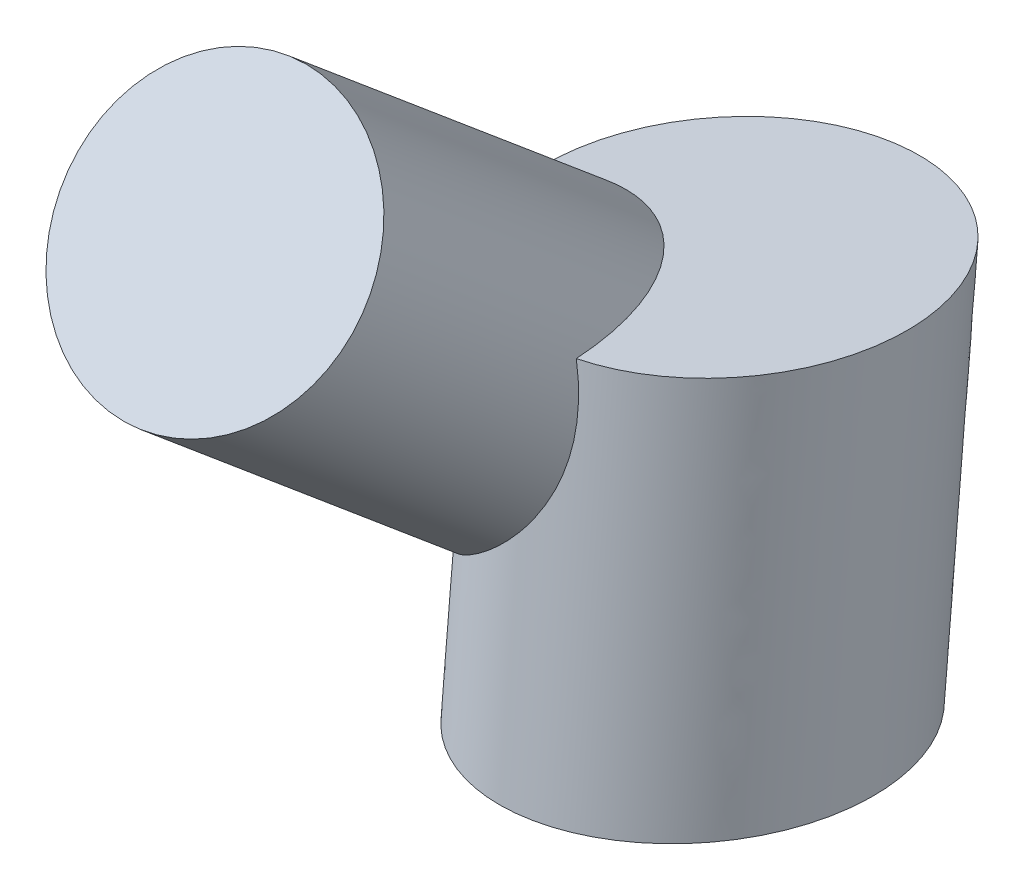
ISO-10303-21;
HEADER;
FILE_DESCRIPTION(('STEP AP214'),'2;1');
FILE_NAME('part.step','',(''),(''),'','','');
FILE_SCHEMA(('AUTOMOTIVE_DESIGN { 1 0 10303 214 1 1 1 1 }'));
ENDSEC;
DATA;
#1=APPLICATION_CONTEXT('core data for automotive mechanical design processes');
#2=APPLICATION_PROTOCOL_DEFINITION('international standard','automotive_design',2000,#1);
#3=PRODUCT_CONTEXT('',#1,'mechanical');
#4=PRODUCT('Part','Part','',(#3));
#5=PRODUCT_RELATED_PRODUCT_CATEGORY('part','',(#4));
#6=PRODUCT_DEFINITION_FORMATION('','',#4);
#7=PRODUCT_DEFINITION_CONTEXT('part definition',#1,'design');
#8=PRODUCT_DEFINITION('design','',#6,#7);
#9=PRODUCT_DEFINITION_SHAPE('','',#8);
#10=(LENGTH_UNIT() NAMED_UNIT(*) SI_UNIT(.MILLI.,.METRE.));
#11=(NAMED_UNIT(*) PLANE_ANGLE_UNIT() SI_UNIT($,.RADIAN.));
#12=(NAMED_UNIT(*) SI_UNIT($,.STERADIAN.) SOLID_ANGLE_UNIT());
#13=UNCERTAINTY_MEASURE_WITH_UNIT(LENGTH_MEASURE(1.E-05),#10,'distance_accuracy_value','');
#14=(GEOMETRIC_REPRESENTATION_CONTEXT(3) GLOBAL_UNCERTAINTY_ASSIGNED_CONTEXT((#13)) GLOBAL_UNIT_ASSIGNED_CONTEXT((#10,
#11,#12)) REPRESENTATION_CONTEXT('',''));
#15=CARTESIAN_POINT('',(0.,0.,0.));
#16=DIRECTION('',(0.,0.,1.));
#17=DIRECTION('',(1.,0.,0.));
#18=AXIS2_PLACEMENT_3D('',#15,#16,#17);
#19=CARTESIAN_POINT('',(9.8530099761229,469.487751563095,-26.0815234338281));
#20=DIRECTION('',(0.,0.996194698091746,-0.0871557427476584));
#21=DIRECTION('',(0.,0.0871557427476584,0.996194698091746));
#22=AXIS2_PLACEMENT_3D('',#19,#20,#21);
#23=ELLIPSE('',#22,19.05,15.875);
#24=DIRECTION('',(0.,-0.996194698091746,0.0871557427476584));
#25=VECTOR('',#24,1.);
#26=SURFACE_OF_LINEAR_EXTRUSION('',#23,#25);
#27=CARTESIAN_POINT('',(13.5633757047033,471.102082707643,-7.62963401766272));
#28=VERTEX_POINT('',#27);
#29=CARTESIAN_POINT('',(-5.90740162400137,469.686880477689,-23.8054695250432));
#30=VERTEX_POINT('',#29);
#31=EDGE_CURVE('E47',#28,#30,#23,.T.);
#32=ORIENTED_EDGE('',*,*,#31,.F.);
#33=CARTESIAN_POINT('',(13.5633757047033,471.102082707643,-7.62963401766271));
#34=CARTESIAN_POINT('',(13.6165670345337,470.827771900835,-7.6210492455901));
#35=CARTESIAN_POINT('',(13.6646932775911,470.55250959644,-7.61124109338902));
#36=CARTESIAN_POINT('',(13.7506920936666,470.00022944991,-7.58884588358467));
#37=CARTESIAN_POINT('',(13.7885547461959,469.723210172275,-7.57625615857145));
#38=CARTESIAN_POINT('',(13.8538160357362,469.167955200506,-7.54797390718162));
#39=CARTESIAN_POINT('',(13.8812094481063,468.889718968926,-7.53227983750484));
#40=CARTESIAN_POINT('',(13.925276085072,468.332565765513,-7.49754116620548));
#41=CARTESIAN_POINT('',(13.9419478488632,468.053648706113,-7.47849610846714));
#42=CARTESIAN_POINT('',(13.9643437608906,467.49443166057,-7.4367833371205));
#43=CARTESIAN_POINT('',(13.970020464502,467.214130890668,-7.41410037901978));
#44=CARTESIAN_POINT('',(13.9699794295825,466.653909551743,-7.3650740135879));
#45=CARTESIAN_POINT('',(13.9642642339391,466.373988911823,-7.33873142437673));
#46=CARTESIAN_POINT('',(13.9411272288269,465.815048108093,-7.2823799401142));
#47=CARTESIAN_POINT('',(13.9237076326214,465.536027784056,-7.25237173909549));
#48=CARTESIAN_POINT('',(13.8768493994267,464.97941159824,-7.18879270569786));
#49=CARTESIAN_POINT('',(13.8474108273517,464.701815728775,-7.15522189256126));
#50=CARTESIAN_POINT('',(13.763279404808,464.048143750294,-7.07193272986096));
#51=CARTESIAN_POINT('',(13.7032976966812,463.672915018382,-7.02077778803651));
#52=CARTESIAN_POINT('',(13.5597952880399,462.927686378044,-6.91321837542489));
#53=CARTESIAN_POINT('',(13.4762707841336,462.557687324635,-6.85681305741457));
#54=CARTESIAN_POINT('',(13.2852750566683,461.824470989986,-6.74022735202834));
#55=CARTESIAN_POINT('',(13.1778012421299,461.461254447129,-6.68004655670526));
#56=CARTESIAN_POINT('',(12.9393246695228,460.744629215983,-6.55812999111552));
#57=CARTESIAN_POINT('',(12.808422588263,460.391185753072,-6.49640180990959));
#58=CARTESIAN_POINT('',(12.5230905383388,459.69388279917,-6.37351963175896));
#59=CARTESIAN_POINT('',(12.3686635716561,459.350022091949,-6.3123655626081));
#60=CARTESIAN_POINT('',(12.0370320558073,458.673118737102,-6.19335741085303));
#61=CARTESIAN_POINT('',(11.8598415345485,458.340069583949,-6.13550132732301));
#62=CARTESIAN_POINT('',(11.5515880984432,457.803557739419,-6.04573997634851));
#63=CARTESIAN_POINT('',(11.4269409868335,457.596685415447,-6.01200173041274));
#64=CARTESIAN_POINT('',(11.169165866053,457.187828967406,-5.94784902788867));
#65=CARTESIAN_POINT('',(11.0360399662644,456.985843644654,-5.91743374967445));
#66=CARTESIAN_POINT('',(10.7617451992319,456.586889258335,-5.86071527076287));
#67=CARTESIAN_POINT('',(10.6205783708441,456.389918941331,-5.834411033948));
#68=CARTESIAN_POINT('',(10.3306759591645,456.001027932633,-5.78667881933683));
#69=CARTESIAN_POINT('',(10.1819398519213,455.8091075919,-5.76525117966572));
#70=CARTESIAN_POINT('',(9.73235304139759,455.249928290219,-5.71031245768859));
#71=CARTESIAN_POINT('',(9.42153493712816,454.889751207018,-5.68472787398842));
#72=CARTESIAN_POINT('',(8.93876370647966,454.364111981239,-5.66635660087526));
#73=CARTESIAN_POINT('',(8.77503169597699,454.191287645471,-5.66356924974426));
#74=CARTESIAN_POINT('',(8.44264420790784,453.850392269869,-5.66522229908513));
#75=CARTESIAN_POINT('',(8.27398785472343,453.682322085981,-5.66966399276517));
#76=CARTESIAN_POINT('',(7.87505719178579,453.295199767119,-5.68908836408938));
#77=CARTESIAN_POINT('',(7.64312560026286,453.077999005175,-5.70711219881489));
#78=CARTESIAN_POINT('',(7.17335279617275,452.651706719835,-5.75801310062853));
#79=CARTESIAN_POINT('',(6.93550930515068,452.442618405057,-5.79089598099697));
#80=CARTESIAN_POINT('',(6.45570948753111,452.032281772116,-5.8722903008697));
#81=CARTESIAN_POINT('',(6.21375261001835,451.831034516198,-5.9208038496964));
#82=CARTESIAN_POINT('',(5.72718490934467,451.435740550277,-6.03404797635889));
#83=CARTESIAN_POINT('',(5.48257086511274,451.241704236185,-6.09880099865345));
#84=CARTESIAN_POINT('',(4.99280684779816,450.860690838361,-6.24472895052429));
#85=CARTESIAN_POINT('',(4.74765694956367,450.673712828018,-6.32590171556779));
#86=CARTESIAN_POINT('',(4.25854275309893,450.306309011974,-6.50465187741623));
#87=CARTESIAN_POINT('',(4.01457811922063,450.125881244834,-6.60222431332489));
#88=CARTESIAN_POINT('',(3.62574284692296,449.841442922815,-6.77156892359237));
#89=CARTESIAN_POINT('',(3.47999348928825,449.7355392457,-6.83819973277153));
#90=CARTESIAN_POINT('',(3.18983246127351,449.52576074089,-6.9772363086371));
#91=CARTESIAN_POINT('',(3.04542056619863,449.421885569029,-7.04964108490221));
#92=CARTESIAN_POINT('',(2.75823574330752,449.216013355384,-7.20011604490567));
#93=CARTESIAN_POINT('',(2.61546272816338,449.114016213353,-7.27818592514003));
#94=CARTESIAN_POINT('',(2.33219465260454,448.911999010274,-7.43965585333366));
#95=CARTESIAN_POINT('',(2.19169479604518,448.811974650019,-7.52304211137375));
#96=CARTESIAN_POINT('',(1.91287674822779,448.613487227757,-7.6951686236373));
#97=CARTESIAN_POINT('',(1.7745586741385,448.515024249601,-7.78390916417644));
#98=CARTESIAN_POINT('',(1.50035413819728,448.319506108636,-7.96656884700615));
#99=CARTESIAN_POINT('',(1.364467800471,448.22245101774,-8.06048825265387));
#100=CARTESIAN_POINT('',(1.22992551594694,448.12602538934,-8.15690688012083));
#101=B_SPLINE_CURVE_WITH_KNOTS('',3,(#33,#34,#35,#36,#37,#38,#39,#40,#41,#42,#43,#44,#45,#46,
#47,#48,#49,#50,#51,#52,#53,#54,#55,#56,#57,#58,#59,#60,#61,#62,#63,#64,#65,#66,#67,#68,#69,#70,
#71,#72,#73,#74,#75,#76,#77,#78,#79,#80,#81,#82,#83,#84,#85,#86,#87,#88,#89,#90,#91,#92,#93,#94,
#95,#96,#97,#98,#99,#100),.UNSPECIFIED.,.F.,.F.,(4,2,2,2,2,2,2,2,2,2,2,2,2,2,2,2,2,2,2,2,2,2,2,
2,2,2,2,2,2,2,2,2,2,4),(0.,0.83861759672078,1.67804290975134,2.51788658999194,3.35784467311395,
4.20141924241197,5.04480553098672,5.88803238287697,6.73125468057897,7.88070713171449,
9.03034538601904,10.1801080754893,11.3250436719521,12.4698332867975,13.6139207857162,
14.345325442489,15.076548843338,15.8075876536324,16.5386771360205,17.9660178458795,
18.680111112075,19.3943321368855,20.3486104435983,21.3032624147305,22.2580432679251,
23.2141510599897,24.1701328951766,25.1258260648564,25.7020022590883,26.2780798322605,
26.8541265652324,27.4287355415606,28.0033752718924,28.5780442509673),.UNSPECIFIED.);
#102=CARTESIAN_POINT('',(1.2299255159471,448.12602538934,-8.15690688012068));
#103=VERTEX_POINT('',#102);
#104=EDGE_CURVE('E54',#28,#103,#101,.T.);
#105=ORIENTED_EDGE('',*,*,#104,.T.);
#106=CARTESIAN_POINT('',(1.39611413213234,447.956050131906,-8.01428070429874));
#107=CARTESIAN_POINT('',(1.27940626923087,448.073794201501,-8.11307970966887));
#108=CARTESIAN_POINT('',(1.16484044467143,448.192769886899,-8.21291216340599));
#109=CARTESIAN_POINT('',(0.939832500503709,448.432972180461,-8.41446581934122));
#110=CARTESIAN_POINT('',(0.829389994450478,448.55419857608,-8.51618684319439));
#111=CARTESIAN_POINT('',(0.50409838025061,448.920829560635,-8.82382676711241));
#112=CARTESIAN_POINT('',(0.295152483936782,449.1693206738,-9.03233556851972));
#113=CARTESIAN_POINT('',(-0.107684436272714,449.672558677037,-9.45460239143092));
#114=CARTESIAN_POINT('',(-0.301608077162463,449.927290337353,-9.66834763365102));
#115=CARTESIAN_POINT('',(-0.676012337318118,450.442523889815,-10.100679917492));
#116=CARTESIAN_POINT('',(-0.856490920837997,450.70302664806,-10.3192676858563));
#117=CARTESIAN_POINT('',(-1.20449964115137,451.228283240622,-10.7600102989482));
#118=CARTESIAN_POINT('',(-1.37205900111147,451.493025740751,-10.9821556331632));
#119=CARTESIAN_POINT('',(-1.69551489023901,452.026668669046,-11.4299352174756));
#120=CARTESIAN_POINT('',(-1.85141042621159,452.295569448949,-11.6555697627159));
#121=CARTESIAN_POINT('',(-2.3028596924854,453.107911324659,-12.3372055310138));
#122=CARTESIAN_POINT('',(-2.58200952808987,453.656737200564,-12.7977251210668));
#123=CARTESIAN_POINT('',(-3.10089451620098,454.764262292295,-13.7270490170578));
#124=CARTESIAN_POINT('',(-3.34068140349183,455.322947462292,-14.1958415371463));
#125=CARTESIAN_POINT('',(-3.78490857890271,456.448350158042,-15.1401665240761));
#126=CARTESIAN_POINT('',(-3.98935616423466,457.01506599933,-15.6156975774825));
#127=CARTESIAN_POINT('',(-4.33656282263723,458.066319283577,-16.497803820568));
#128=CARTESIAN_POINT('',(-4.48397148780892,458.549964141056,-16.9036300421001));
#129=CARTESIAN_POINT('',(-4.75695606058085,459.520886491602,-17.7183306283447));
#130=CARTESIAN_POINT('',(-4.88253041595131,460.008164240369,-18.1272052076158));
#131=CARTESIAN_POINT('',(-5.11297658676444,460.985861238376,-18.9475903980467));
#132=CARTESIAN_POINT('',(-5.21783650517289,461.476282126872,-19.3591023847053));
#133=CARTESIAN_POINT('',(-5.40762056997983,462.459384379012,-20.1840231218852));
#134=CARTESIAN_POINT('',(-5.49254437108227,462.952065781657,-20.5974319051327));
#135=CARTESIAN_POINT('',(-5.64434021639546,463.947160462288,-21.4324154846362));
#136=CARTESIAN_POINT('',(-5.71089688929334,464.449601903571,-21.8540139127057));
#137=CARTESIAN_POINT('',(-5.82462341848205,465.455775422358,-22.6982937412198));
#138=CARTESIAN_POINT('',(-5.8717929446372,465.959507521692,-23.1209751599828));
#139=CARTESIAN_POINT('',(-5.94705984331516,466.967134747163,-23.9664747932404));
#140=CARTESIAN_POINT('',(-5.97518240818654,467.471028772566,-24.3892920841082));
#141=CARTESIAN_POINT('',(-6.01263440090325,468.479200430331,-25.2352485503024));
#142=CARTESIAN_POINT('',(-6.02196482645686,468.983478040907,-25.658387707347));
#143=CARTESIAN_POINT('',(-6.02199002387711,469.487751563096,-26.0815234338285));
#144=B_SPLINE_CURVE_WITH_KNOTS('',3,(#106,#107,#108,#109,#110,#111,#112,#113,#114,#115,#116,
#117,#118,#119,#120,#121,#122,#123,#124,#125,#126,#127,#128,#129,#130,#131,#132,#133,#134,#135,
#136,#137,#138,#139,#140,#141,#142,#143),.UNSPECIFIED.,.F.,.F.,(4,2,2,2,2,2,2,2,2,2,2,2,2,2,2,2,
2,2,4),(0.,0.57893009391759,1.1578057925396,2.31489702111002,3.46940107847964,4.62407958807763,
5.77606454123194,6.92814747652572,9.23342710921038,11.5356522218502,13.8374013786846,
15.7820132477283,17.7267633053129,19.6726270748947,21.6185245445946,23.5960059196398,
25.5735209670007,27.5484153313094,29.5232048421821),.UNSPECIFIED.);
#145=CARTESIAN_POINT('',(-6.00870948574133,468.447273892586,-25.2084590042553));
#146=VERTEX_POINT('',#145);
#147=EDGE_CURVE('E58',#103,#146,#144,.T.);
#148=ORIENTED_EDGE('',*,*,#147,.T.);
#149=CARTESIAN_POINT('',(-6.00870948574133,468.447273892586,-25.2084590042553));
#150=CARTESIAN_POINT('',(-6.00582656788919,468.515267917944,-25.1295635174161));
#151=CARTESIAN_POINT('',(-6.00247858679975,468.58342072954,-25.0508220025972));
#152=CARTESIAN_POINT('',(-5.99486069875364,468.720019829013,-24.8936644846526));
#153=CARTESIAN_POINT('',(-5.99059096381481,468.788466059798,-24.81524842357));
#154=CARTESIAN_POINT('',(-5.98113712018249,468.925646994438,-24.6587371124899));
#155=CARTESIAN_POINT('',(-5.97595309512842,468.994381671345,-24.5806418338154));
#156=CARTESIAN_POINT('',(-5.96467745017632,469.132133923392,-24.4247672729803));
#157=CARTESIAN_POINT('',(-5.95858583226691,469.201151497913,-24.3469879901277));
#158=CARTESIAN_POINT('',(-5.94550109357916,469.339464350468,-24.1917397796198));
#159=CARTESIAN_POINT('',(-5.93850788844439,469.408759653899,-24.1142708817056));
#160=CARTESIAN_POINT('',(-5.9236252659121,469.547622227618,-23.9596377593721));
#161=CARTESIAN_POINT('',(-5.9157356840659,469.617189545541,-23.8824735935545));
#162=CARTESIAN_POINT('',(-5.90740162400138,469.686880477689,-23.8054695250432));
#163=B_SPLINE_CURVE_WITH_KNOTS('',3,(#149,#150,#151,#152,#153,#154,#155,#156,#157,#158,#159,
#160,#161,#162),.UNSPECIFIED.,.F.,.F.,(4,2,2,2,2,2,4),(0.,0.312574921331382,0.625091560236292,
0.937579624878097,1.2500670048378,1.56258364372417,1.87515770956412),.UNSPECIFIED.);
#164=EDGE_CURVE('E69',#146,#30,#163,.T.);
#165=ORIENTED_EDGE('',*,*,#164,.T.);
#166=EDGE_LOOP('',(#32,#105,#148,#165));
#167=FACE_BOUND('',#166,.T.);
#168=CARTESIAN_POINT('',(9.85300997611963,431.532733565799,-22.7608896351423));
#169=DIRECTION('',(0.,0.996194698091746,-0.0871557427476584));
#170=DIRECTION('',(0.,0.0871557427476584,0.996194698091746));
#171=AXIS2_PLACEMENT_3D('',#168,#169,#170);
#172=ELLIPSE('',#171,19.05,15.875);
#173=CARTESIAN_POINT('',(9.85300997611963,433.193050465142,-3.78338063649454));
#174=VERTEX_POINT('',#173);
#175=EDGE_CURVE('E70',#174,#174,#172,.T.);
#176=ORIENTED_EDGE('',*,*,#175,.T.);
#177=EDGE_LOOP('',(#176));
#178=FACE_BOUND('',#177,.T.);
#179=ADVANCED_FACE('F38',(#167,#178),#26,.F.);
#180=CARTESIAN_POINT('',(9.8530099761229,469.487751563095,-26.0815234338281));
#181=DIRECTION('',(0.,0.996194698091746,-0.0871557427476584));
#182=DIRECTION('',(0.,0.0871557427476584,0.996194698091746));
#183=AXIS2_PLACEMENT_3D('',#180,#181,#182);
#184=PLANE('',#183);
#185=ORIENTED_EDGE('',*,*,#31,.T.);
#186=CARTESIAN_POINT('',(0.,471.610512626871,-1.81825344861431));
#187=DIRECTION('',(0.,0.996194698091746,-0.0871557427476584));
#188=DIRECTION('',(0.,-0.0871557427476584,-0.996194698091746));
#189=AXIS2_PLACEMENT_3D('',#186,#187,#188);
#190=ELLIPSE('',#189,24.3559517348276,13.97);
#191=EDGE_CURVE('E11',#28,#30,#190,.T.);
#192=ORIENTED_EDGE('',*,*,#191,.F.);
#193=EDGE_LOOP('',(#185,#192));
#194=FACE_BOUND('',#193,.T.);
#195=ADVANCED_FACE('F66',(#194),#184,.T.);
#196=CARTESIAN_POINT('',(9.85300997611963,431.532733565799,-22.7608896351423));
#197=DIRECTION('',(0.,0.996194698091746,-0.0871557427476584));
#198=DIRECTION('',(0.,0.0871557427476584,0.996194698091746));
#199=AXIS2_PLACEMENT_3D('',#196,#197,#198);
#200=PLANE('',#199);
#201=ORIENTED_EDGE('',*,*,#175,.F.);
#202=EDGE_LOOP('',(#201));
#203=FACE_BOUND('',#202,.T.);
#204=ADVANCED_FACE('F106',(#203),#200,.F.);
#205=CARTESIAN_POINT('',(0.,181.138386289597,215.872322617356));
#206=DIRECTION('',(0.,-0.642787609686521,-0.766044443118993));
#207=DIRECTION('',(0.,0.766044443118993,-0.642787609686521));
#208=AXIS2_PLACEMENT_3D('',#205,#206,#207);
#209=PLANE('',#208);
#210=ORIENTED_EDGE('',*,*,#147,.F.);
#211=CARTESIAN_POINT('',(0.,458.786110692723,-17.1017805265074));
#212=DIRECTION('',(0.,-0.642787609686521,-0.766044443118993));
#213=DIRECTION('',(0.,0.766044443118993,-0.642787609686521));
#214=AXIS2_PLACEMENT_3D('',#211,#212,#213);
#215=CIRCLE('',#214,13.9700000000001);
#216=EDGE_CURVE('E74',#103,#146,#215,.T.);
#217=ORIENTED_EDGE('',*,*,#216,.T.);
#218=EDGE_LOOP('',(#210,#217));
#219=FACE_BOUND('',#218,.T.);
#220=ADVANCED_FACE('F98',(#219),#209,.T.);
#221=CARTESIAN_POINT('',(0.,452.498427017833,-24.5951501351543));
#222=DIRECTION('',(0.,-0.642787609686521,-0.766044443118993));
#223=DIRECTION('',(0.,0.766044443118993,-0.642787609686521));
#224=AXIS2_PLACEMENT_3D('',#221,#222,#223);
#225=CYLINDRICAL_SURFACE('',#224,13.97);
#226=CARTESIAN_POINT('',(0.,485.152037589908,14.3199075752906));
#227=DIRECTION('',(0.,-0.642787609686521,-0.766044443118993));
#228=DIRECTION('',(0.,0.766044443118993,-0.642787609686521));
#229=AXIS2_PLACEMENT_3D('',#226,#227,#228);
#230=CIRCLE('',#229,13.9699999999999);
#231=CARTESIAN_POINT('',(0.,495.85367846028,5.34016466796997));
#232=VERTEX_POINT('',#231);
#233=EDGE_CURVE('E77',#232,#232,#230,.T.);
#234=ORIENTED_EDGE('',*,*,#233,.T.);
#235=EDGE_LOOP('',(#234));
#236=FACE_BOUND('',#235,.T.);
#237=ORIENTED_EDGE('',*,*,#104,.F.);
#238=ORIENTED_EDGE('',*,*,#191,.T.);
#239=ORIENTED_EDGE('',*,*,#164,.F.);
#240=ORIENTED_EDGE('',*,*,#216,.F.);
#241=EDGE_LOOP('',(#237,#238,#239,#240));
#242=FACE_BOUND('',#241,.T.);
#243=ADVANCED_FACE('F72',(#236,#242),#225,.T.);
#244=CARTESIAN_POINT('',(0.,207.504313186782,247.294010719154));
#245=DIRECTION('',(0.,-0.642787609686521,-0.766044443118993));
#246=DIRECTION('',(0.,0.766044443118993,-0.642787609686521));
#247=AXIS2_PLACEMENT_3D('',#244,#245,#246);
#248=PLANE('',#247);
#249=ORIENTED_EDGE('',*,*,#233,.F.);
#250=EDGE_LOOP('',(#249));
#251=FACE_BOUND('',#250,.T.);
#252=ADVANCED_FACE('F97',(#251),#248,.F.);
#253=CLOSED_SHELL('',(#179,#195,#204,#220,#243,#252));
#254=MANIFOLD_SOLID_BREP('B2',#253);
#255=ADVANCED_BREP_SHAPE_REPRESENTATION('',(#18,#254),#14);
#256=SHAPE_DEFINITION_REPRESENTATION(#9,#255);
ENDSEC;
END-ISO-10303-21;
